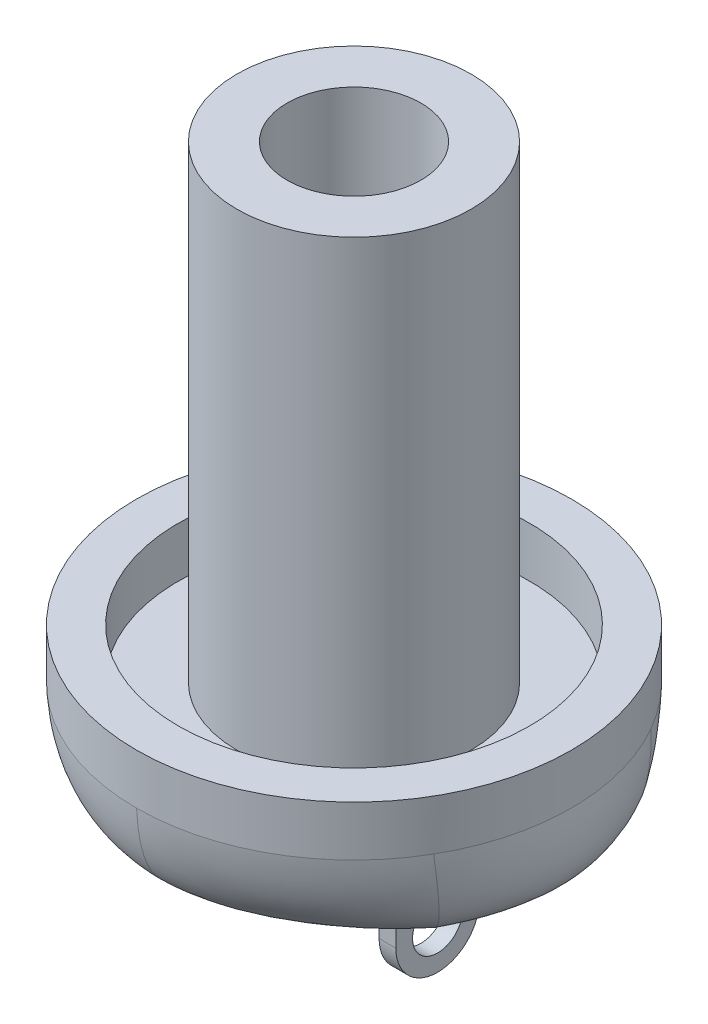
ISO-10303-21;
HEADER;
FILE_DESCRIPTION(('STEP AP214'),'2;1');
FILE_NAME('part.step','',(''),(''),'','','');
FILE_SCHEMA(('AUTOMOTIVE_DESIGN { 1 0 10303 214 1 1 1 1 }'));
ENDSEC;
DATA;
#1=APPLICATION_CONTEXT('core data for automotive mechanical design processes');
#2=APPLICATION_PROTOCOL_DEFINITION('international standard','automotive_design',2000,#1);
#3=PRODUCT_CONTEXT('',#1,'mechanical');
#4=PRODUCT('Part','Part','',(#3));
#5=PRODUCT_RELATED_PRODUCT_CATEGORY('part','',(#4));
#6=PRODUCT_DEFINITION_FORMATION('','',#4);
#7=PRODUCT_DEFINITION_CONTEXT('part definition',#1,'design');
#8=PRODUCT_DEFINITION('design','',#6,#7);
#9=PRODUCT_DEFINITION_SHAPE('','',#8);
#10=(LENGTH_UNIT() NAMED_UNIT(*) SI_UNIT(.MILLI.,.METRE.));
#11=(NAMED_UNIT(*) PLANE_ANGLE_UNIT() SI_UNIT($,.RADIAN.));
#12=(NAMED_UNIT(*) SI_UNIT($,.STERADIAN.) SOLID_ANGLE_UNIT());
#13=UNCERTAINTY_MEASURE_WITH_UNIT(LENGTH_MEASURE(1.E-05),#10,'distance_accuracy_value','');
#14=(GEOMETRIC_REPRESENTATION_CONTEXT(3) GLOBAL_UNCERTAINTY_ASSIGNED_CONTEXT((#13)) GLOBAL_UNIT_ASSIGNED_CONTEXT((#10,
#11,#12)) REPRESENTATION_CONTEXT('',''));
#15=CARTESIAN_POINT('',(0.,0.,0.));
#16=DIRECTION('',(0.,0.,1.));
#17=DIRECTION('',(1.,0.,0.));
#18=AXIS2_PLACEMENT_3D('',#15,#16,#17);
#19=CARTESIAN_POINT('',(-100.,0.,0.));
#20=DIRECTION('',(1.,0.,0.));
#21=DIRECTION('',(0.,0.,-1.));
#22=AXIS2_PLACEMENT_3D('',#19,#20,#21);
#23=CYLINDRICAL_SURFACE('',#22,25.);
#24=CARTESIAN_POINT('',(-10.,0.,0.));
#25=DIRECTION('',(1.,0.,0.));
#26=DIRECTION('',(0.,0.,-1.));
#27=AXIS2_PLACEMENT_3D('',#24,#25,#26);
#28=CIRCLE('',#27,25.);
#29=CARTESIAN_POINT('',(-10.,0.,-25.));
#30=VERTEX_POINT('',#29);
#31=CARTESIAN_POINT('',(-10.,0.,25.));
#32=VERTEX_POINT('',#31);
#33=EDGE_CURVE('E313',#30,#32,#28,.F.);
#34=ORIENTED_EDGE('',*,*,#33,.F.);
#35=DIRECTION('',(1.,0.,0.));
#36=VECTOR('',#35,1.);
#37=CARTESIAN_POINT('',(-100.,0.,-25.));
#38=LINE('',#37,#36);
#39=CARTESIAN_POINT('',(0.,0.,-25.));
#40=VERTEX_POINT('',#39);
#41=EDGE_CURVE('E596',#30,#40,#38,.T.);
#42=ORIENTED_EDGE('',*,*,#41,.T.);
#43=CARTESIAN_POINT('',(0.,0.,0.));
#44=DIRECTION('',(1.,0.,0.));
#45=DIRECTION('',(0.,0.,-1.));
#46=AXIS2_PLACEMENT_3D('',#43,#44,#45);
#47=CIRCLE('',#46,25.);
#48=CARTESIAN_POINT('',(0.,0.,25.));
#49=VERTEX_POINT('',#48);
#50=EDGE_CURVE('E591',#49,#40,#47,.T.);
#51=ORIENTED_EDGE('',*,*,#50,.F.);
#52=DIRECTION('',(1.,0.,0.));
#53=VECTOR('',#52,1.);
#54=CARTESIAN_POINT('',(-100.,0.,25.));
#55=LINE('',#54,#53);
#56=EDGE_CURVE('E583',#32,#49,#55,.T.);
#57=ORIENTED_EDGE('',*,*,#56,.F.);
#58=EDGE_LOOP('',(#34,#42,#51,#57));
#59=FACE_BOUND('',#58,.T.);
#60=ADVANCED_FACE('F175',(#59),#23,.T.);
#61=CARTESIAN_POINT('',(-100.,0.,0.));
#62=DIRECTION('',(1.,0.,0.));
#63=DIRECTION('',(0.,0.,-1.));
#64=AXIS2_PLACEMENT_3D('',#61,#62,#63);
#65=CYLINDRICAL_SURFACE('',#64,15.);
#66=CARTESIAN_POINT('',(-10.,0.,0.));
#67=DIRECTION('',(1.,0.,0.));
#68=DIRECTION('',(0.,0.,-1.));
#69=AXIS2_PLACEMENT_3D('',#66,#67,#68);
#70=CIRCLE('',#69,15.);
#71=CARTESIAN_POINT('',(-10.,0.,-15.));
#72=VERTEX_POINT('',#71);
#73=EDGE_CURVE('E179',#72,#72,#70,.F.);
#74=ORIENTED_EDGE('',*,*,#73,.T.);
#75=EDGE_LOOP('',(#74));
#76=FACE_BOUND('',#75,.T.);
#77=CARTESIAN_POINT('',(0.,0.,0.));
#78=DIRECTION('',(1.,0.,0.));
#79=DIRECTION('',(0.,0.,-1.));
#80=AXIS2_PLACEMENT_3D('',#77,#78,#79);
#81=CIRCLE('',#80,15.);
#82=CARTESIAN_POINT('',(0.,0.,-15.));
#83=VERTEX_POINT('',#82);
#84=EDGE_CURVE('E510',#83,#83,#81,.T.);
#85=ORIENTED_EDGE('',*,*,#84,.T.);
#86=EDGE_LOOP('',(#85));
#87=FACE_BOUND('',#86,.T.);
#88=ADVANCED_FACE('F563',(#76,#87),#65,.F.);
#89=CARTESIAN_POINT('',(-90.,0.,0.));
#90=DIRECTION('',(-1.,0.,0.));
#91=DIRECTION('',(0.,-1.,0.));
#92=AXIS2_PLACEMENT_3D('',#89,#90,#91);
#93=CIRCLE('',#92,25.);
#94=CARTESIAN_POINT('',(-90.,0.,25.));
#95=VERTEX_POINT('',#94);
#96=CARTESIAN_POINT('',(-90.,0.,-25.));
#97=VERTEX_POINT('',#96);
#98=EDGE_CURVE('E193',#95,#97,#93,.F.);
#99=ORIENTED_EDGE('',*,*,#98,.F.);
#100=CARTESIAN_POINT('',(-100.,0.,25.));
#101=VERTEX_POINT('',#100);
#102=EDGE_CURVE('E201',#101,#95,#55,.T.);
#103=ORIENTED_EDGE('',*,*,#102,.F.);
#104=CARTESIAN_POINT('',(-100.,0.,0.));
#105=DIRECTION('',(1.,0.,0.));
#106=DIRECTION('',(0.,0.,-1.));
#107=AXIS2_PLACEMENT_3D('',#104,#105,#106);
#108=CIRCLE('',#107,25.);
#109=CARTESIAN_POINT('',(-100.,0.,-25.));
#110=VERTEX_POINT('',#109);
#111=EDGE_CURVE('E604',#101,#110,#108,.T.);
#112=ORIENTED_EDGE('',*,*,#111,.T.);
#113=EDGE_CURVE('E577',#110,#97,#38,.T.);
#114=ORIENTED_EDGE('',*,*,#113,.T.);
#115=EDGE_LOOP('',(#99,#103,#112,#114));
#116=FACE_BOUND('',#115,.T.);
#117=ADVANCED_FACE('F177',(#116),#23,.T.);
#118=CARTESIAN_POINT('',(-100.,0.,25.));
#119=DIRECTION('',(0.,0.,1.));
#120=DIRECTION('',(1.,0.,0.));
#121=AXIS2_PLACEMENT_3D('',#118,#119,#120);
#122=PLANE('',#121);
#123=DIRECTION('',(0.,1.,0.));
#124=VECTOR('',#123,1.);
#125=CARTESIAN_POINT('',(-10.,0.,25.));
#126=LINE('',#125,#124);
#127=CARTESIAN_POINT('',(-10.,19.3601616627467,25.));
#128=VERTEX_POINT('',#127);
#129=EDGE_CURVE('E310',#32,#128,#126,.T.);
#130=ORIENTED_EDGE('',*,*,#129,.F.);
#131=ORIENTED_EDGE('',*,*,#56,.T.);
#132=DIRECTION('',(0.,-1.,0.));
#133=VECTOR('',#132,1.);
#134=CARTESIAN_POINT('',(0.,0.,25.));
#135=LINE('',#134,#133);
#136=CARTESIAN_POINT('',(0.,34.1754207810267,25.));
#137=VERTEX_POINT('',#136);
#138=EDGE_CURVE('E610',#137,#49,#135,.T.);
#139=ORIENTED_EDGE('',*,*,#138,.F.);
#140=DIRECTION('',(-1.,0.,0.));
#141=VECTOR('',#140,1.);
#142=CARTESIAN_POINT('',(-100.,34.1754207810267,25.));
#143=LINE('',#142,#141);
#144=CARTESIAN_POINT('',(-50.,34.1754207810267,25.));
#145=VERTEX_POINT('',#144);
#146=EDGE_CURVE('E229',#137,#145,#143,.T.);
#147=ORIENTED_EDGE('',*,*,#146,.T.);
#148=DIRECTION('',(1.,0.,0.));
#149=VECTOR('',#148,1.);
#150=CARTESIAN_POINT('',(-100.,34.1754207810267,25.));
#151=LINE('',#150,#149);
#152=CARTESIAN_POINT('',(-100.,34.1754207810267,25.));
#153=VERTEX_POINT('',#152);
#154=EDGE_CURVE('E588',#153,#145,#151,.T.);
#155=ORIENTED_EDGE('',*,*,#154,.F.);
#156=DIRECTION('',(0.,-1.,0.));
#157=VECTOR('',#156,1.);
#158=CARTESIAN_POINT('',(-100.,0.,25.));
#159=LINE('',#158,#157);
#160=EDGE_CURVE('E581',#153,#101,#159,.T.);
#161=ORIENTED_EDGE('',*,*,#160,.T.);
#162=ORIENTED_EDGE('',*,*,#102,.T.);
#163=DIRECTION('',(0.,-1.,0.));
#164=VECTOR('',#163,1.);
#165=CARTESIAN_POINT('',(-90.,0.,25.));
#166=LINE('',#165,#164);
#167=CARTESIAN_POINT('',(-90.,19.3601616627467,25.));
#168=VERTEX_POINT('',#167);
#169=EDGE_CURVE('E305',#168,#95,#166,.T.);
#170=ORIENTED_EDGE('',*,*,#169,.F.);
#171=DIRECTION('',(-1.,0.,0.));
#172=VECTOR('',#171,1.);
#173=CARTESIAN_POINT('',(-100.,19.3601616627467,25.));
#174=LINE('',#173,#172);
#175=EDGE_CURVE('E281',#128,#168,#174,.T.);
#176=ORIENTED_EDGE('',*,*,#175,.F.);
#177=EDGE_LOOP('',(#130,#131,#139,#147,#155,#161,#162,#170,#176));
#178=FACE_BOUND('',#177,.T.);
#179=ADVANCED_FACE('F572',(#178),#122,.T.);
#180=CARTESIAN_POINT('',(-100.,34.1754207810267,-25.));
#181=DIRECTION('',(0.,0.,-1.));
#182=DIRECTION('',(-1.,0.,0.));
#183=AXIS2_PLACEMENT_3D('',#180,#181,#182);
#184=PLANE('',#183);
#185=DIRECTION('',(0.,-1.,0.));
#186=VECTOR('',#185,1.);
#187=CARTESIAN_POINT('',(-10.,-25.,-25.));
#188=LINE('',#187,#186);
#189=CARTESIAN_POINT('',(-10.,19.3601616627467,-25.));
#190=VERTEX_POINT('',#189);
#191=EDGE_CURVE('E285',#190,#30,#188,.T.);
#192=ORIENTED_EDGE('',*,*,#191,.F.);
#193=DIRECTION('',(1.,0.,0.));
#194=VECTOR('',#193,1.);
#195=CARTESIAN_POINT('',(-10.,19.3601616627467,-25.));
#196=LINE('',#195,#194);
#197=CARTESIAN_POINT('',(-90.,19.3601616627467,-25.));
#198=VERTEX_POINT('',#197);
#199=EDGE_CURVE('E278',#198,#190,#196,.T.);
#200=ORIENTED_EDGE('',*,*,#199,.F.);
#201=DIRECTION('',(0.,1.,0.));
#202=VECTOR('',#201,1.);
#203=CARTESIAN_POINT('',(-90.,19.3601616627467,-25.));
#204=LINE('',#203,#202);
#205=EDGE_CURVE('E287',#97,#198,#204,.T.);
#206=ORIENTED_EDGE('',*,*,#205,.F.);
#207=ORIENTED_EDGE('',*,*,#113,.F.);
#208=DIRECTION('',(0.,1.,0.));
#209=VECTOR('',#208,1.);
#210=CARTESIAN_POINT('',(-100.,34.1754207810267,-25.));
#211=LINE('',#210,#209);
#212=CARTESIAN_POINT('',(-100.,34.1754207810267,-25.));
#213=VERTEX_POINT('',#212);
#214=EDGE_CURVE('E600',#110,#213,#211,.T.);
#215=ORIENTED_EDGE('',*,*,#214,.T.);
#216=DIRECTION('',(-1.,0.,0.));
#217=VECTOR('',#216,1.);
#218=CARTESIAN_POINT('',(-100.,34.1754207810267,-25.));
#219=LINE('',#218,#217);
#220=CARTESIAN_POINT('',(0.,34.1754207810267,-25.));
#221=VERTEX_POINT('',#220);
#222=EDGE_CURVE('E595',#213,#221,#219,.F.);
#223=ORIENTED_EDGE('',*,*,#222,.T.);
#224=DIRECTION('',(0.,1.,0.));
#225=VECTOR('',#224,1.);
#226=CARTESIAN_POINT('',(0.,34.1754207810267,-25.));
#227=LINE('',#226,#225);
#228=EDGE_CURVE('E605',#40,#221,#227,.T.);
#229=ORIENTED_EDGE('',*,*,#228,.F.);
#230=ORIENTED_EDGE('',*,*,#41,.F.);
#231=EDGE_LOOP('',(#192,#200,#206,#207,#215,#223,#229,#230));
#232=FACE_BOUND('',#231,.T.);
#233=ADVANCED_FACE('F295',(#232),#184,.T.);
#234=CARTESIAN_POINT('',(-100.,0.,0.));
#235=DIRECTION('',(1.,0.,0.));
#236=DIRECTION('',(0.,0.,-1.));
#237=AXIS2_PLACEMENT_3D('',#234,#235,#236);
#238=PLANE('',#237);
#239=CARTESIAN_POINT('',(-100.,0.,0.));
#240=DIRECTION('',(1.,0.,0.));
#241=DIRECTION('',(0.,0.,-1.));
#242=AXIS2_PLACEMENT_3D('',#239,#240,#241);
#243=CIRCLE('',#242,15.);
#244=CARTESIAN_POINT('',(-100.,0.,-15.));
#245=VERTEX_POINT('',#244);
#246=EDGE_CURVE('E403',#245,#245,#243,.T.);
#247=ORIENTED_EDGE('',*,*,#246,.T.);
#248=EDGE_LOOP('',(#247));
#249=FACE_BOUND('',#248,.T.);
#250=ORIENTED_EDGE('',*,*,#111,.F.);
#251=ORIENTED_EDGE('',*,*,#160,.F.);
#252=DIRECTION('',(0.,0.,-1.));
#253=VECTOR('',#252,1.);
#254=CARTESIAN_POINT('',(-100.,34.1754207810267,0.));
#255=LINE('',#254,#253);
#256=EDGE_CURVE('E599',#213,#153,#255,.F.);
#257=ORIENTED_EDGE('',*,*,#256,.F.);
#258=ORIENTED_EDGE('',*,*,#214,.F.);
#259=EDGE_LOOP('',(#250,#251,#257,#258));
#260=FACE_BOUND('',#259,.T.);
#261=ADVANCED_FACE('F629',(#249,#260),#238,.F.);
#262=CARTESIAN_POINT('',(0.,0.,0.));
#263=DIRECTION('',(1.,0.,0.));
#264=DIRECTION('',(0.,0.,-1.));
#265=AXIS2_PLACEMENT_3D('',#262,#263,#264);
#266=PLANE('',#265);
#267=ORIENTED_EDGE('',*,*,#84,.F.);
#268=EDGE_LOOP('',(#267));
#269=FACE_BOUND('',#268,.T.);
#270=ORIENTED_EDGE('',*,*,#50,.T.);
#271=ORIENTED_EDGE('',*,*,#228,.T.);
#272=DIRECTION('',(0.,0.,-1.));
#273=VECTOR('',#272,1.);
#274=CARTESIAN_POINT('',(0.,34.1754207810267,0.));
#275=LINE('',#274,#273);
#276=EDGE_CURVE('E609',#221,#137,#275,.F.);
#277=ORIENTED_EDGE('',*,*,#276,.T.);
#278=ORIENTED_EDGE('',*,*,#138,.T.);
#279=EDGE_LOOP('',(#270,#271,#277,#278));
#280=FACE_BOUND('',#279,.T.);
#281=ADVANCED_FACE('F633',(#269,#280),#266,.T.);
#282=CARTESIAN_POINT('',(-90.,0.,0.));
#283=DIRECTION('',(-1.,0.,0.));
#284=DIRECTION('',(0.,-1.,0.));
#285=AXIS2_PLACEMENT_3D('',#282,#283,#284);
#286=CIRCLE('',#285,15.);
#287=CARTESIAN_POINT('',(-90.,-15.,0.));
#288=VERTEX_POINT('',#287);
#289=EDGE_CURVE('E303',#288,#288,#286,.F.);
#290=ORIENTED_EDGE('',*,*,#289,.T.);
#291=EDGE_LOOP('',(#290));
#292=FACE_BOUND('',#291,.T.);
#293=ORIENTED_EDGE('',*,*,#246,.F.);
#294=EDGE_LOOP('',(#293));
#295=FACE_BOUND('',#294,.T.);
#296=ADVANCED_FACE('F549',(#292,#295),#65,.F.);
#297=CARTESIAN_POINT('',(62.583302491977,100.,65.));
#298=CARTESIAN_POINT('',(70.1119688009917,17.4242328553317,59.569598271961));
#299=CARTESIAN_POINT('',(19.721422354028,64.2635709447024,38.5878027364718));
#300=CARTESIAN_POINT('',(0.,34.1754207810267,25.));
#301=CARTESIAN_POINT('',(59.7471424793025,100.,69.9123732403475));
#302=CARTESIAN_POINT('',(66.1072626577805,17.1659675832769,63.9735039948538));
#303=CARTESIAN_POINT('',(17.4441307180792,64.3890071563449,40.2616132551313));
#304=CARTESIAN_POINT('',(-2.08333333333334,34.1754207810267,25.));
#305=CARTESIAN_POINT('',(53.4309717499813,100.,79.3653620141092));
#306=CARTESIAN_POINT('',(57.4911805240872,16.6171538801608,72.6746007480164));
#307=CARTESIAN_POINT('',(12.6820535353364,64.6555591060854,43.4898591532903));
#308=CARTESIAN_POINT('',(-6.25,34.1754207810267,25.));
#309=CARTESIAN_POINT('',(42.1867905734161,99.9999999999997,92.1867989802641));
#310=CARTESIAN_POINT('',(43.1209532015571,15.7455085869756,85.0325674161009));
#311=CARTESIAN_POINT('',(4.95964721941277,65.0789063203787,47.8863620804266));
#312=CARTESIAN_POINT('',(-12.5,34.1754207810267,25.));
#313=CARTESIAN_POINT('',(29.3653558268991,100.,103.430938986221));
#314=CARTESIAN_POINT('',(27.6992234990592,14.8738632937912,96.3390027773865));
#315=CARTESIAN_POINT('',(-3.28851028649476,65.5022535346724,51.7570993541634));
#316=CARTESIAN_POINT('',(-18.75,34.1754207810267,25.));
#317=CARTESIAN_POINT('',(15.1859133627292,99.9999999999999,112.90531388203));
#318=CARTESIAN_POINT('',(11.6383093850604,14.0506427391165,106.253909063908));
#319=CARTESIAN_POINT('',(-12.0000215173383,65.9020814592829,55.0310987797908));
#320=CARTESIAN_POINT('',(-25.,34.1754207810267,25.));
#321=CARTESIAN_POINT('',(-0.108857214104519,100.,120.447883819597));
#322=CARTESIAN_POINT('',(-4.63384867017866,13.3242716614626,114.45757404227));
#323=CARTESIAN_POINT('',(-21.1046777571733,66.2548708045275,57.6475309298837));
#324=CARTESIAN_POINT('',(-31.25,34.1754207810267,25.));
#325=CARTESIAN_POINT('',(-16.2572854762297,99.9999999999999,125.929502020066));
#326=CARTESIAN_POINT('',(-20.6766496481421,12.7431747993393,120.652214191904));
#327=CARTESIAN_POINT('',(-30.5259400159274,66.5371022807231,59.5565307334298));
#328=CARTESIAN_POINT('',(-37.5,34.1754207810267,25.));
#329=CARTESIAN_POINT('',(-32.9830661902238,100.,129.256530080649));
#330=CARTESIAN_POINT('',(-36.039735992947,12.3557768912573,124.563718242951));
#331=CARTESIAN_POINT('',(-40.1823910348448,66.725256598187,60.720069244773));
#332=CARTESIAN_POINT('',(-43.75,34.1754207810267,25.));
#333=CARTESIAN_POINT('',(-44.3276799746509,100.,130.));
#334=CARTESIAN_POINT('',(-45.5240088719895,12.2589274142367,125.48273619185));
#335=CARTESIAN_POINT('',(-46.7203377693281,66.7722951775529,60.9815248406771));
#336=CARTESIAN_POINT('',(-47.9166666666667,34.1754207810267,25.));
#337=CARTESIAN_POINT('',(-50.,100.,130.));
#338=CARTESIAN_POINT('',(-50.,12.2589274142367,125.48273619185));
#339=CARTESIAN_POINT('',(-50.,66.7722951775529,60.9815248406771));
#340=CARTESIAN_POINT('',(-50.,34.1754207810267,25.));
#341=B_SPLINE_SURFACE_WITH_KNOTS('',3,3,((#297,#298,#299,#300),(#301,#302,#303,#304),(#305,#306,
#307,#308),(#309,#310,#311,#312),(#313,#314,#315,#316),(#317,#318,#319,#320),(#321,#322,#323,
#324),(#325,#326,#327,#328),(#329,#330,#331,#332),(#333,#334,#335,#336),(#337,#338,#339,#340)),
.UNSPECIFIED.,.F.,.F.,.F.,(4,1,1,1,1,1,1,1,4),(4,4),(0.833333333333333,0.854166666666667,0.875,
0.895833333333333,0.916666666666667,0.9375,0.958333333333333,0.979166666666667,1.),(0.,1.),.UNSPECIFIED.);
#342=CARTESIAN_POINT('',(-50.,100.,0.));
#343=DIRECTION('',(0.,1.,0.));
#344=DIRECTION('',(0.,0.,1.));
#345=AXIS2_PLACEMENT_3D('',#342,#343,#344);
#346=CIRCLE('',#345,130.);
#347=CARTESIAN_POINT('',(-50.,100.,130.));
#348=VERTEX_POINT('',#347);
#349=CARTESIAN_POINT('',(62.583818582411,100.,65.0002981616136));
#350=VERTEX_POINT('',#349);
#351=EDGE_CURVE('E338',#348,#350,#346,.T.);
#352=CARTESIAN_POINT('',(-50.,100.,130.));
#353=CARTESIAN_POINT('',(-50.,12.2589274142367,125.48273619185));
#354=CARTESIAN_POINT('',(-50.,66.7722951775529,60.9815248406771));
#355=CARTESIAN_POINT('',(-50.,34.1754207810267,25.));
#356=B_SPLINE_CURVE_WITH_KNOTS('',3,(#352,#353,#354,#355),.UNSPECIFIED.,.F.,.F.,(4,4),(0.,1.),.UNSPECIFIED.);
#357=EDGE_CURVE('E464',#348,#145,#356,.T.);
#358=CARTESIAN_POINT('',(62.583302491977,100.,65.));
#359=CARTESIAN_POINT('',(70.1119688009917,17.4242328553317,59.569598271961));
#360=CARTESIAN_POINT('',(19.721422354028,64.2635709447024,38.5878027364718));
#361=CARTESIAN_POINT('',(0.,34.1754207810267,25.));
#362=B_SPLINE_CURVE_WITH_KNOTS('',3,(#358,#359,#360,#361),.UNSPECIFIED.,.F.,.F.,(4,4),(0.,1.),.UNSPECIFIED.);
#363=EDGE_CURVE('E452',#350,#137,#362,.T.);
#364=ORIENTED_EDGE('',*,*,#351,.F.);
#365=ORIENTED_EDGE('',*,*,#357,.T.);
#366=ORIENTED_EDGE('',*,*,#146,.F.);
#367=ORIENTED_EDGE('',*,*,#363,.F.);
#368=EDGE_LOOP('',(#364,#365,#366,#367));
#369=FACE_BOUND('',#368,.T.);
#370=ADVANCED_FACE('F427',(#369),#341,.T.);
#371=CARTESIAN_POINT('',(62.583302491977,100.,-65.));
#372=CARTESIAN_POINT('',(70.1119688009917,17.4242328553317,-59.569598271961));
#373=CARTESIAN_POINT('',(19.721422354028,64.2635709447024,-38.5878027364719));
#374=CARTESIAN_POINT('',(0.,34.1754207810267,-25.));
#375=CARTESIAN_POINT('',(65.4194624985673,100.,-60.0876267701908));
#376=CARTESIAN_POINT('',(73.4222304957022,17.6824981273864,-54.4712481116494));
#377=CARTESIAN_POINT('',(20.6098250990599,64.1381347330599,-35.5251033324363));
#378=CARTESIAN_POINT('',(0.,34.1754207810267,-22.9166666666667));
#379=CARTESIAN_POINT('',(70.4479167400798,99.9999999999999,-49.8911663183449));
#380=CARTESIAN_POINT('',(79.4360739927216,18.166745512489,-44.1678622415403));
#381=CARTESIAN_POINT('',(22.1791316557132,63.9029418362301,-29.280343956774));
#382=CARTESIAN_POINT('',(0.,34.1754207810267,-18.75));
#383=CARTESIAN_POINT('',(75.9294851991456,100.,-33.7427038623781));
#384=CARTESIAN_POINT('',(86.2843017686454,18.7478423746125,-28.7786592549083));
#385=CARTESIAN_POINT('',(23.8781073134475,63.6207103600346,-19.6490627347286));
#386=CARTESIAN_POINT('',(0.,34.1754207810267,-12.5));
#387=CARTESIAN_POINT('',(79.2565388889945,99.9999999999997,-17.0169409139187));
#388=CARTESIAN_POINT('',(90.6315700973536,19.1352402826942,-13.8513319452771));
#389=CARTESIAN_POINT('',(24.9016493243165,63.4325560425706,-9.85261259409343));
#390=CARTESIAN_POINT('',(0.,34.1754207810267,-6.24999999999999));
#391=CARTESIAN_POINT('',(80.,100.,-5.67232001318054));
#392=CARTESIAN_POINT('',(91.6595189718928,19.2320897597149,-4.47599111989816));
#393=CARTESIAN_POINT('',(25.1281007232148,63.3855174632047,-3.27966222661575));
#394=CARTESIAN_POINT('',(0.,34.1754207810267,-2.08333333333333));
#395=CARTESIAN_POINT('',(80.,100.,5.6723200131806));
#396=CARTESIAN_POINT('',(91.6595189718928,19.2320897597149,4.47599111989816));
#397=CARTESIAN_POINT('',(25.1281007232148,63.3855174632047,3.27966222661575));
#398=CARTESIAN_POINT('',(0.,34.1754207810267,2.08333333333334));
#399=CARTESIAN_POINT('',(79.2565388889948,99.9999999999999,17.0169409139189));
#400=CARTESIAN_POINT('',(90.6315700973538,19.1352402826943,13.8513319452771));
#401=CARTESIAN_POINT('',(24.9016493243166,63.4325560425706,9.85261259409346));
#402=CARTESIAN_POINT('',(0.,34.1754207810267,6.25000000000001));
#403=CARTESIAN_POINT('',(75.929485199145,100.,33.7427038623781));
#404=CARTESIAN_POINT('',(86.2843017686451,18.7478423746123,28.7786592549082));
#405=CARTESIAN_POINT('',(23.8781073134473,63.6207103600345,19.6490627347286));
#406=CARTESIAN_POINT('',(0.,34.1754207810267,12.5));
#407=CARTESIAN_POINT('',(70.4479167400802,99.9999999999999,49.8911663183448));
#408=CARTESIAN_POINT('',(79.4360739927219,18.166745512489,44.1678622415402));
#409=CARTESIAN_POINT('',(22.1791316557134,63.9029418362301,29.2803439567739));
#410=CARTESIAN_POINT('',(0.,34.1754207810267,18.75));
#411=CARTESIAN_POINT('',(65.4194624985673,100.,60.0876267701907));
#412=CARTESIAN_POINT('',(73.4222304957023,17.6824981273864,54.4712481116493));
#413=CARTESIAN_POINT('',(20.6098250990599,64.1381347330599,35.5251033324363));
#414=CARTESIAN_POINT('',(0.,34.1754207810267,22.9166666666667));
#415=CARTESIAN_POINT('',(62.583302491977,100.,65.));
#416=CARTESIAN_POINT('',(70.1119688009917,17.4242328553317,59.569598271961));
#417=CARTESIAN_POINT('',(19.721422354028,64.2635709447024,38.5878027364718));
#418=CARTESIAN_POINT('',(0.,34.1754207810267,25.));
#419=B_SPLINE_SURFACE_WITH_KNOTS('',3,3,((#371,#372,#373,#374),(#375,#376,#377,#378),(#379,#380,
#381,#382),(#383,#384,#385,#386),(#387,#388,#389,#390),(#391,#392,#393,#394),(#395,#396,#397,
#398),(#399,#400,#401,#402),(#403,#404,#405,#406),(#407,#408,#409,#410),(#411,#412,#413,#414),
(#415,#416,#417,#418)),.UNSPECIFIED.,.F.,.F.,.F.,(4,1,1,1,2,1,1,1,4),(4,4),(0.666666666666667,
0.6875,0.708333333333333,0.729166666666667,0.75,0.770833333333333,0.791666666666667,0.8125,
0.833333333333333),(0.,1.),.UNSPECIFIED.);
#420=CARTESIAN_POINT('',(62.5838249390601,100.,-65.000301828654));
#421=VERTEX_POINT('',#420);
#422=EDGE_CURVE('E542',#350,#421,#346,.T.);
#423=CARTESIAN_POINT('',(62.583302491977,100.,-65.));
#424=CARTESIAN_POINT('',(70.1119688009917,17.4242328553317,-59.569598271961));
#425=CARTESIAN_POINT('',(19.721422354028,64.2635709447024,-38.5878027364719));
#426=CARTESIAN_POINT('',(0.,34.1754207810267,-25.));
#427=B_SPLINE_CURVE_WITH_KNOTS('',3,(#423,#424,#425,#426),.UNSPECIFIED.,.F.,.F.,(4,4),(0.,1.),.UNSPECIFIED.);
#428=EDGE_CURVE('E445',#421,#221,#427,.T.);
#429=ORIENTED_EDGE('',*,*,#422,.F.);
#430=ORIENTED_EDGE('',*,*,#363,.T.);
#431=ORIENTED_EDGE('',*,*,#276,.F.);
#432=ORIENTED_EDGE('',*,*,#428,.F.);
#433=EDGE_LOOP('',(#429,#430,#431,#432));
#434=FACE_BOUND('',#433,.T.);
#435=ADVANCED_FACE('F416',(#434),#419,.T.);
#436=CARTESIAN_POINT('',(-162.583302491977,100.,-65.0000000000001));
#437=CARTESIAN_POINT('',(-170.111968800992,17.4242328553316,-59.5695982719611));
#438=CARTESIAN_POINT('',(-119.721422354028,64.2635709447024,-38.5878027364719));
#439=CARTESIAN_POINT('',(-100.,34.1754207810267,-25.));
#440=CARTESIAN_POINT('',(-159.747142479302,100.,-69.9123732403477));
#441=CARTESIAN_POINT('',(-166.10726265778,17.1659675832768,-63.9735039948539));
#442=CARTESIAN_POINT('',(-117.444130718079,64.3890071563449,-40.2616132551313));
#443=CARTESIAN_POINT('',(-97.9166666666667,34.1754207810267,-25.));
#444=CARTESIAN_POINT('',(-153.430971749981,100.,-79.3653620141093));
#445=CARTESIAN_POINT('',(-157.491180524087,16.6171538801606,-72.6746007480165));
#446=CARTESIAN_POINT('',(-112.682053535336,64.6555591060853,-43.4898591532903));
#447=CARTESIAN_POINT('',(-93.75,34.1754207810267,-25.));
#448=CARTESIAN_POINT('',(-142.186790573415,99.9999999999998,-92.1867989802644));
#449=CARTESIAN_POINT('',(-143.120953201557,15.7455085869756,-85.0325674161011));
#450=CARTESIAN_POINT('',(-104.959647219413,65.0789063203788,-47.8863620804267));
#451=CARTESIAN_POINT('',(-87.5,34.1754207810267,-25.));
#452=CARTESIAN_POINT('',(-129.365355826899,100.,-103.43093898622));
#453=CARTESIAN_POINT('',(-127.699223499059,14.873863293791,-96.3390027773863));
#454=CARTESIAN_POINT('',(-96.7114897135053,65.5022535346724,-51.7570993541633));
#455=CARTESIAN_POINT('',(-81.25,34.1754207810267,-25.));
#456=CARTESIAN_POINT('',(-115.185913362729,99.9999999999999,-112.90531388203));
#457=CARTESIAN_POINT('',(-111.63830938506,14.0506427391164,-106.253909063908));
#458=CARTESIAN_POINT('',(-87.9999784826616,65.9020814592829,-55.0310987797909));
#459=CARTESIAN_POINT('',(-75.0000000000001,34.1754207810267,-25.));
#460=CARTESIAN_POINT('',(-99.891142785896,100.,-120.447883819596));
#461=CARTESIAN_POINT('',(-95.3661513298217,13.3242716614626,-114.45757404227));
#462=CARTESIAN_POINT('',(-78.8953222428269,66.2548708045276,-57.6475309298835));
#463=CARTESIAN_POINT('',(-68.75,34.1754207810267,-25.));
#464=CARTESIAN_POINT('',(-83.7427145237699,99.9999999999999,-125.929502020066));
#465=CARTESIAN_POINT('',(-79.3233503518577,12.7431747993393,-120.652214191904));
#466=CARTESIAN_POINT('',(-69.4740599840725,66.5371022807231,-59.55653073343));
#467=CARTESIAN_POINT('',(-62.5,34.1754207810267,-25.));
#468=CARTESIAN_POINT('',(-67.0169338097764,100.,-129.256530080649));
#469=CARTESIAN_POINT('',(-63.9602640070532,12.3557768912573,-124.563718242951));
#470=CARTESIAN_POINT('',(-59.8176089651553,66.725256598187,-60.7200692447729));
#471=CARTESIAN_POINT('',(-56.25,34.1754207810267,-25.));
#472=CARTESIAN_POINT('',(-55.6723200253491,100.,-130.));
#473=CARTESIAN_POINT('',(-54.4759911280105,12.2589274142367,-125.48273619185));
#474=CARTESIAN_POINT('',(-53.2796622306719,66.7722951775529,-60.9815248406771));
#475=CARTESIAN_POINT('',(-52.0833333333333,34.1754207810267,-25.));
#476=CARTESIAN_POINT('',(-44.3276799746509,100.,-130.));
#477=CARTESIAN_POINT('',(-45.5240088719895,12.2589274142368,-125.48273619185));
#478=CARTESIAN_POINT('',(-46.7203377693281,66.7722951775529,-60.9815248406771));
#479=CARTESIAN_POINT('',(-47.9166666666667,34.1754207810267,-25.));
#480=CARTESIAN_POINT('',(-32.9830661902239,99.9999999999999,-129.256530080649));
#481=CARTESIAN_POINT('',(-36.0397359929471,12.3557768912572,-124.563718242951));
#482=CARTESIAN_POINT('',(-40.1823910348448,66.7252565981869,-60.720069244773));
#483=CARTESIAN_POINT('',(-43.75,34.1754207810267,-25.));
#484=CARTESIAN_POINT('',(-16.2572854762296,100.,-125.929502020066));
#485=CARTESIAN_POINT('',(-20.6766496481421,12.7431747993396,-120.652214191904));
#486=CARTESIAN_POINT('',(-30.5259400159274,66.5371022807233,-59.55653073343));
#487=CARTESIAN_POINT('',(-37.5,34.1754207810267,-25.));
#488=CARTESIAN_POINT('',(-0.108857214104596,99.9999999999998,-120.447883819596));
#489=CARTESIAN_POINT('',(-4.63384867017874,13.3242716614624,-114.45757404227));
#490=CARTESIAN_POINT('',(-21.1046777571734,66.2548708045274,-57.6475309298835));
#491=CARTESIAN_POINT('',(-31.25,34.1754207810267,-25.));
#492=CARTESIAN_POINT('',(15.1859133627291,100.,-112.90531388203));
#493=CARTESIAN_POINT('',(11.6383093850604,14.0506427391166,-106.253909063908));
#494=CARTESIAN_POINT('',(-12.0000215173383,65.9020814592829,-55.031098779791));
#495=CARTESIAN_POINT('',(-25.,34.1754207810267,-25.));
#496=CARTESIAN_POINT('',(29.3653558268991,99.9999999999999,-103.43093898622));
#497=CARTESIAN_POINT('',(27.6992234990592,14.873863293791,-96.3390027773862));
#498=CARTESIAN_POINT('',(-3.28851028649473,65.5022535346723,-51.7570993541633));
#499=CARTESIAN_POINT('',(-18.75,34.1754207810267,-25.));
#500=CARTESIAN_POINT('',(42.1867905734158,100.,-92.1867989802647));
#501=CARTESIAN_POINT('',(43.1209532015569,15.7455085869761,-85.0325674161013));
#502=CARTESIAN_POINT('',(4.95964721941264,65.0789063203789,-47.8863620804268));
#503=CARTESIAN_POINT('',(-12.5,34.1754207810267,-25.));
#504=CARTESIAN_POINT('',(53.4309717499813,99.9999999999998,-79.365362014109));
#505=CARTESIAN_POINT('',(57.4911805240872,16.6171538801605,-72.6746007480163));
#506=CARTESIAN_POINT('',(12.6820535353364,64.6555591060852,-43.4898591532903));
#507=CARTESIAN_POINT('',(-6.25000000000001,34.1754207810267,-25.));
#508=CARTESIAN_POINT('',(59.7471424793024,100.,-69.9123732403476));
#509=CARTESIAN_POINT('',(66.1072626577805,17.1659675832769,-63.9735039948538));
#510=CARTESIAN_POINT('',(17.4441307180791,64.3890071563449,-40.2616132551313));
#511=CARTESIAN_POINT('',(-2.08333333333334,34.1754207810267,-25.));
#512=CARTESIAN_POINT('',(62.583302491977,100.,-65.));
#513=CARTESIAN_POINT('',(70.1119688009917,17.4242328553317,-59.569598271961));
#514=CARTESIAN_POINT('',(19.721422354028,64.2635709447024,-38.5878027364719));
#515=CARTESIAN_POINT('',(0.,34.1754207810267,-25.));
#516=B_SPLINE_SURFACE_WITH_KNOTS('',3,3,((#436,#437,#438,#439),(#440,#441,#442,#443),(#444,#445,
#446,#447),(#448,#449,#450,#451),(#452,#453,#454,#455),(#456,#457,#458,#459),(#460,#461,#462,
#463),(#464,#465,#466,#467),(#468,#469,#470,#471),(#472,#473,#474,#475),(#476,#477,#478,#479),
(#480,#481,#482,#483),(#484,#485,#486,#487),(#488,#489,#490,#491),(#492,#493,#494,#495),(#496,
#497,#498,#499),(#500,#501,#502,#503),(#504,#505,#506,#507),(#508,#509,#510,#511),(#512,#513,
#514,#515)),.UNSPECIFIED.,.F.,.F.,.F.,(4,1,1,1,1,1,1,1,2,1,1,1,1,1,1,1,4),(4,4),
(0.333333333333333,0.354166666666667,0.375,0.395833333333333,0.416666666666667,0.4375,
0.458333333333333,0.479166666666667,0.5,0.520833333333333,0.541666666666667,0.5625,
0.583333333333333,0.604166666666667,0.625,0.645833333333333,0.666666666666667),(0.,1.),.UNSPECIFIED.);
#517=CARTESIAN_POINT('',(-162.583815409981,100.,-65.0002963287974));
#518=VERTEX_POINT('',#517);
#519=EDGE_CURVE('E237',#421,#518,#346,.T.);
#520=CARTESIAN_POINT('',(-162.583302491977,100.,-65.0000000000001));
#521=CARTESIAN_POINT('',(-170.111968800992,17.4242328553316,-59.5695982719611));
#522=CARTESIAN_POINT('',(-119.721422354028,64.2635709447024,-38.5878027364719));
#523=CARTESIAN_POINT('',(-100.,34.1754207810267,-25.));
#524=B_SPLINE_CURVE_WITH_KNOTS('',3,(#520,#521,#522,#523),.UNSPECIFIED.,.F.,.F.,(4,4),(0.,1.),.UNSPECIFIED.);
#525=EDGE_CURVE('E453',#518,#213,#524,.T.);
#526=ORIENTED_EDGE('',*,*,#519,.F.);
#527=ORIENTED_EDGE('',*,*,#428,.T.);
#528=ORIENTED_EDGE('',*,*,#222,.F.);
#529=ORIENTED_EDGE('',*,*,#525,.F.);
#530=EDGE_LOOP('',(#526,#527,#528,#529));
#531=FACE_BOUND('',#530,.T.);
#532=ADVANCED_FACE('F405',(#531),#516,.T.);
#533=CARTESIAN_POINT('',(-162.583302491977,100.,65.));
#534=CARTESIAN_POINT('',(-170.111968800992,17.4242328553317,59.5695982719612));
#535=CARTESIAN_POINT('',(-119.721422354028,64.2635709447024,38.5878027364719));
#536=CARTESIAN_POINT('',(-100.,34.1754207810267,25.));
#537=CARTESIAN_POINT('',(-165.419462498567,100.,60.0876267701908));
#538=CARTESIAN_POINT('',(-173.422230495702,17.6824981273864,54.4712481116494));
#539=CARTESIAN_POINT('',(-120.60982509906,64.1381347330599,35.5251033324363));
#540=CARTESIAN_POINT('',(-100.,34.1754207810267,22.9166666666667));
#541=CARTESIAN_POINT('',(-170.44791674008,99.9999999999999,49.8911663183449));
#542=CARTESIAN_POINT('',(-179.436073992722,18.166745512489,44.1678622415404));
#543=CARTESIAN_POINT('',(-122.179131655713,63.9029418362301,29.280343956774));
#544=CARTESIAN_POINT('',(-100.,34.1754207810267,18.75));
#545=CARTESIAN_POINT('',(-175.929485199145,100.,33.7427038623781));
#546=CARTESIAN_POINT('',(-186.284301768645,18.7478423746124,28.7786592549083));
#547=CARTESIAN_POINT('',(-123.878107313447,63.6207103600346,19.6490627347286));
#548=CARTESIAN_POINT('',(-99.9999999999999,34.1754207810267,12.5));
#549=CARTESIAN_POINT('',(-179.256538888995,99.9999999999998,17.0169409139188));
#550=CARTESIAN_POINT('',(-190.631570097354,19.1352402826942,13.8513319452771));
#551=CARTESIAN_POINT('',(-124.901649324317,63.4325560425706,9.85261259409345));
#552=CARTESIAN_POINT('',(-100.,34.1754207810266,6.25));
#553=CARTESIAN_POINT('',(-180.,100.,5.67232001318056));
#554=CARTESIAN_POINT('',(-191.659518971893,19.2320897597148,4.47599111989816));
#555=CARTESIAN_POINT('',(-125.128100723215,63.3855174632047,3.27966222661575));
#556=CARTESIAN_POINT('',(-100.,34.1754207810267,2.08333333333333));
#557=CARTESIAN_POINT('',(-180.,100.,-5.67232001318061));
#558=CARTESIAN_POINT('',(-191.659518971893,19.2320897597148,-4.47599111989817));
#559=CARTESIAN_POINT('',(-125.128100723215,63.3855174632047,-3.27966222661575));
#560=CARTESIAN_POINT('',(-100.,34.1754207810267,-2.08333333333334));
#561=CARTESIAN_POINT('',(-179.256538888995,100.,-17.0169409139189));
#562=CARTESIAN_POINT('',(-190.631570097354,19.1352402826943,-13.8513319452771));
#563=CARTESIAN_POINT('',(-124.901649324317,63.4325560425707,-9.85261259409345));
#564=CARTESIAN_POINT('',(-100.,34.1754207810267,-6.24999999999999));
#565=CARTESIAN_POINT('',(-175.929485199145,100.,-33.7427038623781));
#566=CARTESIAN_POINT('',(-186.284301768645,18.7478423746122,-28.7786592549083));
#567=CARTESIAN_POINT('',(-123.878107313447,63.6207103600345,-19.6490627347286));
#568=CARTESIAN_POINT('',(-100.,34.1754207810267,-12.5));
#569=CARTESIAN_POINT('',(-170.44791674008,99.9999999999999,-49.8911663183449));
#570=CARTESIAN_POINT('',(-179.436073992722,18.1667455124889,-44.1678622415403));
#571=CARTESIAN_POINT('',(-122.179131655713,63.9029418362301,-29.280343956774));
#572=CARTESIAN_POINT('',(-100.,34.1754207810267,-18.75));
#573=CARTESIAN_POINT('',(-165.419462498567,100.,-60.0876267701909));
#574=CARTESIAN_POINT('',(-173.422230495702,17.6824981273863,-54.4712481116494));
#575=CARTESIAN_POINT('',(-120.60982509906,64.1381347330599,-35.5251033324363));
#576=CARTESIAN_POINT('',(-100.,34.1754207810267,-22.9166666666667));
#577=CARTESIAN_POINT('',(-162.583302491977,100.,-65.0000000000001));
#578=CARTESIAN_POINT('',(-170.111968800992,17.4242328553316,-59.5695982719611));
#579=CARTESIAN_POINT('',(-119.721422354028,64.2635709447024,-38.5878027364719));
#580=CARTESIAN_POINT('',(-100.,34.1754207810267,-25.));
#581=B_SPLINE_SURFACE_WITH_KNOTS('',3,3,((#533,#534,#535,#536),(#537,#538,#539,#540),(#541,#542,
#543,#544),(#545,#546,#547,#548),(#549,#550,#551,#552),(#553,#554,#555,#556),(#557,#558,#559,
#560),(#561,#562,#563,#564),(#565,#566,#567,#568),(#569,#570,#571,#572),(#573,#574,#575,#576),
(#577,#578,#579,#580)),.UNSPECIFIED.,.F.,.F.,.F.,(4,1,1,1,2,1,1,1,4),(4,4),(0.166666666666667,
0.1875,0.208333333333333,0.229166666666667,0.25,0.270833333333333,0.291666666666667,0.3125,
0.333333333333333),(0.,1.),.UNSPECIFIED.);
#582=CARTESIAN_POINT('',(-162.583824939041,100.,65.0003018286431));
#583=VERTEX_POINT('',#582);
#584=EDGE_CURVE('E499',#518,#583,#346,.T.);
#585=CARTESIAN_POINT('',(-162.583302491977,100.,65.));
#586=CARTESIAN_POINT('',(-170.111968800992,17.4242328553317,59.5695982719612));
#587=CARTESIAN_POINT('',(-119.721422354028,64.2635709447024,38.5878027364719));
#588=CARTESIAN_POINT('',(-100.,34.1754207810267,25.));
#589=B_SPLINE_CURVE_WITH_KNOTS('',3,(#585,#586,#587,#588),.UNSPECIFIED.,.F.,.F.,(4,4),(0.,1.),.UNSPECIFIED.);
#590=EDGE_CURVE('E467',#583,#153,#589,.T.);
#591=ORIENTED_EDGE('',*,*,#584,.F.);
#592=ORIENTED_EDGE('',*,*,#525,.T.);
#593=ORIENTED_EDGE('',*,*,#256,.T.);
#594=ORIENTED_EDGE('',*,*,#590,.F.);
#595=EDGE_LOOP('',(#591,#592,#593,#594));
#596=FACE_BOUND('',#595,.T.);
#597=ADVANCED_FACE('F378',(#596),#581,.T.);
#598=CARTESIAN_POINT('',(-50.,100.,130.));
#599=CARTESIAN_POINT('',(-50.,12.2589274142367,125.48273619185));
#600=CARTESIAN_POINT('',(-50.,66.7722951775529,60.9815248406771));
#601=CARTESIAN_POINT('',(-50.,34.1754207810267,25.));
#602=CARTESIAN_POINT('',(-55.6723200253491,100.,130.));
#603=CARTESIAN_POINT('',(-54.4759911280105,12.2589274142367,125.48273619185));
#604=CARTESIAN_POINT('',(-53.2796622306719,66.7722951775529,60.9815248406771));
#605=CARTESIAN_POINT('',(-52.0833333333333,34.1754207810267,25.));
#606=CARTESIAN_POINT('',(-67.0169338097764,100.,129.256530080649));
#607=CARTESIAN_POINT('',(-63.9602640070532,12.3557768912573,124.563718242951));
#608=CARTESIAN_POINT('',(-59.8176089651553,66.725256598187,60.720069244773));
#609=CARTESIAN_POINT('',(-56.25,34.1754207810267,25.));
#610=CARTESIAN_POINT('',(-83.7427145237703,100.,125.929502020066));
#611=CARTESIAN_POINT('',(-79.3233503518579,12.7431747993395,120.652214191904));
#612=CARTESIAN_POINT('',(-69.4740599840726,66.5371022807232,59.55653073343));
#613=CARTESIAN_POINT('',(-62.5,34.1754207810267,25.));
#614=CARTESIAN_POINT('',(-99.8911427858955,99.9999999999999,120.447883819596));
#615=CARTESIAN_POINT('',(-95.3661513298214,13.3242716614626,114.45757404227));
#616=CARTESIAN_POINT('',(-78.8953222428267,66.2548708045275,57.6475309298835));
#617=CARTESIAN_POINT('',(-68.75,34.1754207810267,25.));
#618=CARTESIAN_POINT('',(-115.185913362729,100.,112.90531388203));
#619=CARTESIAN_POINT('',(-111.63830938506,14.0506427391166,106.253909063909));
#620=CARTESIAN_POINT('',(-87.9999784826617,65.9020814592829,55.0310987797911));
#621=CARTESIAN_POINT('',(-75.,34.1754207810267,25.));
#622=CARTESIAN_POINT('',(-129.365355826899,99.9999999999999,103.43093898622));
#623=CARTESIAN_POINT('',(-127.699223499059,14.873863293791,96.3390027773862));
#624=CARTESIAN_POINT('',(-96.7114897135052,65.5022535346723,51.7570993541633));
#625=CARTESIAN_POINT('',(-81.25,34.1754207810267,25.));
#626=CARTESIAN_POINT('',(-142.186790573416,99.9999999999999,92.1867989802649));
#627=CARTESIAN_POINT('',(-143.120953201557,15.7455085869758,85.0325674161016));
#628=CARTESIAN_POINT('',(-104.959647219413,65.0789063203788,47.8863620804269));
#629=CARTESIAN_POINT('',(-87.5,34.1754207810267,25.));
#630=CARTESIAN_POINT('',(-153.430971749981,100.,79.3653620141087));
#631=CARTESIAN_POINT('',(-157.491180524087,16.6171538801606,72.6746007480162));
#632=CARTESIAN_POINT('',(-112.682053535336,64.6555591060853,43.4898591532902));
#633=CARTESIAN_POINT('',(-93.75,34.1754207810267,25.));
#634=CARTESIAN_POINT('',(-159.747142479302,100.,69.9123732403475));
#635=CARTESIAN_POINT('',(-166.107262657781,17.1659675832769,63.9735039948539));
#636=CARTESIAN_POINT('',(-117.444130718079,64.3890071563449,40.2616132551313));
#637=CARTESIAN_POINT('',(-97.9166666666667,34.1754207810267,25.));
#638=CARTESIAN_POINT('',(-162.583302491977,100.,65.));
#639=CARTESIAN_POINT('',(-170.111968800992,17.4242328553317,59.5695982719612));
#640=CARTESIAN_POINT('',(-119.721422354028,64.2635709447024,38.5878027364719));
#641=CARTESIAN_POINT('',(-100.,34.1754207810267,25.));
#642=B_SPLINE_SURFACE_WITH_KNOTS('',3,3,((#598,#599,#600,#601),(#602,#603,#604,#605),(#606,#607,
#608,#609),(#610,#611,#612,#613),(#614,#615,#616,#617),(#618,#619,#620,#621),(#622,#623,#624,
#625),(#626,#627,#628,#629),(#630,#631,#632,#633),(#634,#635,#636,#637),(#638,#639,#640,#641)),
.UNSPECIFIED.,.F.,.F.,.F.,(4,1,1,1,1,1,1,1,4),(4,4),(0.,0.0208333333333333,0.0416666666666667,
0.0625,0.0833333333333333,0.104166666666667,0.125,0.145833333333333,0.166666666666667),(0.,1.),.UNSPECIFIED.);
#643=EDGE_CURVE('E534',#583,#348,#346,.T.);
#644=ORIENTED_EDGE('',*,*,#643,.F.);
#645=ORIENTED_EDGE('',*,*,#590,.T.);
#646=ORIENTED_EDGE('',*,*,#154,.T.);
#647=ORIENTED_EDGE('',*,*,#357,.F.);
#648=EDGE_LOOP('',(#644,#645,#646,#647));
#649=FACE_BOUND('',#648,.T.);
#650=ADVANCED_FACE('F372',(#649),#642,.T.);
#651=CARTESIAN_POINT('',(-50.,130.,0.));
#652=DIRECTION('',(0.,1.,0.));
#653=DIRECTION('',(0.,0.,1.));
#654=AXIS2_PLACEMENT_3D('',#651,#652,#653);
#655=PLANE('',#654);
#656=CARTESIAN_POINT('',(-50.,130.,0.));
#657=DIRECTION('',(0.,1.,0.));
#658=DIRECTION('',(0.,0.,1.));
#659=AXIS2_PLACEMENT_3D('',#656,#657,#658);
#660=CIRCLE('',#659,130.);
#661=CARTESIAN_POINT('',(-50.,130.,130.));
#662=VERTEX_POINT('',#661);
#663=EDGE_CURVE('E334',#662,#662,#660,.T.);
#664=ORIENTED_EDGE('',*,*,#663,.T.);
#665=EDGE_LOOP('',(#664));
#666=FACE_BOUND('',#665,.T.);
#667=CARTESIAN_POINT('',(-50.,130.,0.));
#668=DIRECTION('',(0.,1.,0.));
#669=DIRECTION('',(0.,0.,1.));
#670=AXIS2_PLACEMENT_3D('',#667,#668,#669);
#671=CIRCLE('',#670,105.);
#672=CARTESIAN_POINT('',(-50.,130.,105.));
#673=VERTEX_POINT('',#672);
#674=EDGE_CURVE('E327',#673,#673,#671,.T.);
#675=ORIENTED_EDGE('',*,*,#674,.F.);
#676=EDGE_LOOP('',(#675));
#677=FACE_BOUND('',#676,.T.);
#678=ADVANCED_FACE('F363',(#666,#677),#655,.T.);
#679=CARTESIAN_POINT('',(-50.,130.,0.));
#680=DIRECTION('',(0.,-1.,0.));
#681=DIRECTION('',(0.,0.,-1.));
#682=AXIS2_PLACEMENT_3D('',#679,#680,#681);
#683=CYLINDRICAL_SURFACE('',#682,130.);
#684=ORIENTED_EDGE('',*,*,#663,.F.);
#685=EDGE_LOOP('',(#684));
#686=FACE_BOUND('',#685,.T.);
#687=ORIENTED_EDGE('',*,*,#351,.T.);
#688=ORIENTED_EDGE('',*,*,#422,.T.);
#689=ORIENTED_EDGE('',*,*,#519,.T.);
#690=ORIENTED_EDGE('',*,*,#584,.T.);
#691=ORIENTED_EDGE('',*,*,#643,.T.);
#692=EDGE_LOOP('',(#687,#688,#689,#690,#691));
#693=FACE_BOUND('',#692,.T.);
#694=ADVANCED_FACE('F352',(#686,#693),#683,.T.);
#695=CARTESIAN_POINT('',(-50.,130.,0.));
#696=DIRECTION('',(0.,-1.,0.));
#697=DIRECTION('',(0.,0.,-1.));
#698=AXIS2_PLACEMENT_3D('',#695,#696,#697);
#699=CYLINDRICAL_SURFACE('',#698,105.);
#700=ORIENTED_EDGE('',*,*,#674,.T.);
#701=EDGE_LOOP('',(#700));
#702=FACE_BOUND('',#701,.T.);
#703=CARTESIAN_POINT('',(-50.,100.,0.));
#704=DIRECTION('',(0.,1.,0.));
#705=DIRECTION('',(0.,0.,1.));
#706=AXIS2_PLACEMENT_3D('',#703,#704,#705);
#707=CIRCLE('',#706,105.);
#708=CARTESIAN_POINT('',(-50.,100.,105.));
#709=VERTEX_POINT('',#708);
#710=EDGE_CURVE('E185',#709,#709,#707,.F.);
#711=ORIENTED_EDGE('',*,*,#710,.T.);
#712=EDGE_LOOP('',(#711));
#713=FACE_BOUND('',#712,.T.);
#714=ADVANCED_FACE('F362',(#702,#713),#699,.F.);
#715=CARTESIAN_POINT('',(-50.,100.,0.));
#716=DIRECTION('',(0.,1.,0.));
#717=DIRECTION('',(0.,0.,1.));
#718=AXIS2_PLACEMENT_3D('',#715,#716,#717);
#719=PLANE('',#718);
#720=CARTESIAN_POINT('',(-50.,100.,0.));
#721=DIRECTION('',(0.,1.,0.));
#722=DIRECTION('',(0.,0.,1.));
#723=AXIS2_PLACEMENT_3D('',#720,#721,#722);
#724=CIRCLE('',#723,70.);
#725=CARTESIAN_POINT('',(-50.,100.,70.));
#726=VERTEX_POINT('',#725);
#727=EDGE_CURVE('E322',#726,#726,#724,.T.);
#728=ORIENTED_EDGE('',*,*,#727,.F.);
#729=EDGE_LOOP('',(#728));
#730=FACE_BOUND('',#729,.T.);
#731=ORIENTED_EDGE('',*,*,#710,.F.);
#732=EDGE_LOOP('',(#731));
#733=FACE_BOUND('',#732,.T.);
#734=ADVANCED_FACE('F366',(#730,#733),#719,.T.);
#735=CARTESIAN_POINT('',(-50.,380.,0.));
#736=DIRECTION('',(0.,1.,0.));
#737=DIRECTION('',(0.,0.,1.));
#738=AXIS2_PLACEMENT_3D('',#735,#736,#737);
#739=PLANE('',#738);
#740=CARTESIAN_POINT('',(-50.,380.,0.));
#741=DIRECTION('',(0.,1.,0.));
#742=DIRECTION('',(0.,0.,1.));
#743=AXIS2_PLACEMENT_3D('',#740,#741,#742);
#744=CIRCLE('',#743,70.);
#745=CARTESIAN_POINT('',(-50.,380.,70.));
#746=VERTEX_POINT('',#745);
#747=EDGE_CURVE('E323',#746,#746,#744,.T.);
#748=ORIENTED_EDGE('',*,*,#747,.T.);
#749=EDGE_LOOP('',(#748));
#750=FACE_BOUND('',#749,.T.);
#751=CARTESIAN_POINT('',(-50.,380.,0.));
#752=DIRECTION('',(0.,1.,0.));
#753=DIRECTION('',(0.,0.,1.));
#754=AXIS2_PLACEMENT_3D('',#751,#752,#753);
#755=CIRCLE('',#754,40.);
#756=CARTESIAN_POINT('',(-50.,380.,40.));
#757=VERTEX_POINT('',#756);
#758=EDGE_CURVE('E318',#757,#757,#755,.T.);
#759=ORIENTED_EDGE('',*,*,#758,.F.);
#760=EDGE_LOOP('',(#759));
#761=FACE_BOUND('',#760,.T.);
#762=ADVANCED_FACE('F369',(#750,#761),#739,.T.);
#763=CARTESIAN_POINT('',(-50.,380.,0.));
#764=DIRECTION('',(0.,-1.,0.));
#765=DIRECTION('',(0.,0.,-1.));
#766=AXIS2_PLACEMENT_3D('',#763,#764,#765);
#767=CYLINDRICAL_SURFACE('',#766,70.);
#768=ORIENTED_EDGE('',*,*,#747,.F.);
#769=EDGE_LOOP('',(#768));
#770=FACE_BOUND('',#769,.T.);
#771=ORIENTED_EDGE('',*,*,#727,.T.);
#772=EDGE_LOOP('',(#771));
#773=FACE_BOUND('',#772,.T.);
#774=ADVANCED_FACE('F707',(#770,#773),#767,.T.);
#775=CARTESIAN_POINT('',(-50.,380.,0.));
#776=DIRECTION('',(0.,-1.,0.));
#777=DIRECTION('',(0.,0.,-1.));
#778=AXIS2_PLACEMENT_3D('',#775,#776,#777);
#779=CYLINDRICAL_SURFACE('',#778,40.);
#780=ORIENTED_EDGE('',*,*,#758,.T.);
#781=EDGE_LOOP('',(#780));
#782=FACE_BOUND('',#781,.T.);
#783=CARTESIAN_POINT('',(-50.,100.,0.));
#784=DIRECTION('',(0.,1.,0.));
#785=DIRECTION('',(0.,0.,1.));
#786=AXIS2_PLACEMENT_3D('',#783,#784,#785);
#787=CIRCLE('',#786,40.);
#788=CARTESIAN_POINT('',(-50.,100.,40.));
#789=VERTEX_POINT('',#788);
#790=EDGE_CURVE('E13',#789,#789,#787,.F.);
#791=ORIENTED_EDGE('',*,*,#790,.T.);
#792=EDGE_LOOP('',(#791));
#793=FACE_BOUND('',#792,.T.);
#794=ADVANCED_FACE('F702',(#782,#793),#779,.F.);
#795=ORIENTED_EDGE('',*,*,#790,.F.);
#796=EDGE_LOOP('',(#795));
#797=FACE_BOUND('',#796,.T.);
#798=ADVANCED_FACE('F371',(#797),#719,.T.);
#799=CARTESIAN_POINT('',(-10.,-25.,455.));
#800=DIRECTION('',(1.,0.,0.));
#801=DIRECTION('',(0.,0.,-1.));
#802=AXIS2_PLACEMENT_3D('',#799,#800,#801);
#803=PLANE('',#802);
#804=ORIENTED_EDGE('',*,*,#33,.T.);
#805=ORIENTED_EDGE('',*,*,#129,.T.);
#806=DIRECTION('',(0.,0.,-1.));
#807=VECTOR('',#806,1.);
#808=CARTESIAN_POINT('',(-10.,19.3601616627467,455.));
#809=LINE('',#808,#807);
#810=EDGE_CURVE('E284',#128,#190,#809,.T.);
#811=ORIENTED_EDGE('',*,*,#810,.T.);
#812=ORIENTED_EDGE('',*,*,#191,.T.);
#813=EDGE_LOOP('',(#804,#805,#811,#812));
#814=FACE_BOUND('',#813,.T.);
#815=ORIENTED_EDGE('',*,*,#73,.F.);
#816=EDGE_LOOP('',(#815));
#817=FACE_BOUND('',#816,.T.);
#818=ADVANCED_FACE('F552',(#814,#817),#803,.F.);
#819=CARTESIAN_POINT('',(-90.,19.3601616627467,455.));
#820=DIRECTION('',(-1.,0.,0.));
#821=DIRECTION('',(0.,-1.,0.));
#822=AXIS2_PLACEMENT_3D('',#819,#820,#821);
#823=PLANE('',#822);
#824=ORIENTED_EDGE('',*,*,#98,.T.);
#825=ORIENTED_EDGE('',*,*,#205,.T.);
#826=DIRECTION('',(0.,0.,-1.));
#827=VECTOR('',#826,1.);
#828=CARTESIAN_POINT('',(-90.,19.3601616627467,455.));
#829=LINE('',#828,#827);
#830=EDGE_CURVE('E274',#168,#198,#829,.T.);
#831=ORIENTED_EDGE('',*,*,#830,.F.);
#832=ORIENTED_EDGE('',*,*,#169,.T.);
#833=EDGE_LOOP('',(#824,#825,#831,#832));
#834=FACE_BOUND('',#833,.T.);
#835=ORIENTED_EDGE('',*,*,#289,.F.);
#836=EDGE_LOOP('',(#835));
#837=FACE_BOUND('',#836,.T.);
#838=ADVANCED_FACE('F288',(#834,#837),#823,.F.);
#839=CARTESIAN_POINT('',(-10.,19.3601616627467,455.));
#840=DIRECTION('',(0.,1.,0.));
#841=DIRECTION('',(0.,0.,1.));
#842=AXIS2_PLACEMENT_3D('',#839,#840,#841);
#843=PLANE('',#842);
#844=ORIENTED_EDGE('',*,*,#175,.T.);
#845=ORIENTED_EDGE('',*,*,#830,.T.);
#846=ORIENTED_EDGE('',*,*,#199,.T.);
#847=ORIENTED_EDGE('',*,*,#810,.F.);
#848=EDGE_LOOP('',(#844,#845,#846,#847));
#849=FACE_BOUND('',#848,.T.);
#850=ADVANCED_FACE('F275',(#849),#843,.F.);
#851=CLOSED_SHELL('',(#60,#88,#117,#179,#233,#261,#281,#296,#370,#435,#532,#597,#650,#678,#694,
#714,#734,#762,#774,#794,#798,#818,#838,#850));
#852=MANIFOLD_SOLID_BREP('B2',#851);
#853=ADVANCED_BREP_SHAPE_REPRESENTATION('',(#18,#852),#14);
#854=SHAPE_DEFINITION_REPRESENTATION(#9,#853);
ENDSEC;
END-ISO-10303-21;
